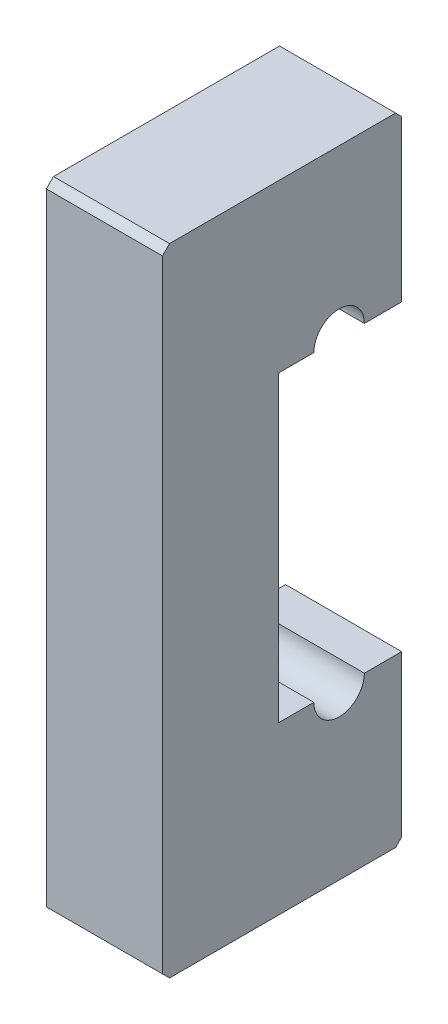
ISO-10303-21;
HEADER;
FILE_DESCRIPTION(('STEP AP214'),'2;1');
FILE_NAME('part.step','',(''),(''),'','','');
FILE_SCHEMA(('AUTOMOTIVE_DESIGN { 1 0 10303 214 1 1 1 1 }'));
ENDSEC;
DATA;
#1=APPLICATION_CONTEXT('core data for automotive mechanical design processes');
#2=APPLICATION_PROTOCOL_DEFINITION('international standard','automotive_design',2000,#1);
#3=PRODUCT_CONTEXT('',#1,'mechanical');
#4=PRODUCT('Part','Part','',(#3));
#5=PRODUCT_RELATED_PRODUCT_CATEGORY('part','',(#4));
#6=PRODUCT_DEFINITION_FORMATION('','',#4);
#7=PRODUCT_DEFINITION_CONTEXT('part definition',#1,'design');
#8=PRODUCT_DEFINITION('design','',#6,#7);
#9=PRODUCT_DEFINITION_SHAPE('','',#8);
#10=(LENGTH_UNIT() NAMED_UNIT(*) SI_UNIT(.MILLI.,.METRE.));
#11=(NAMED_UNIT(*) PLANE_ANGLE_UNIT() SI_UNIT($,.RADIAN.));
#12=(NAMED_UNIT(*) SI_UNIT($,.STERADIAN.) SOLID_ANGLE_UNIT());
#13=UNCERTAINTY_MEASURE_WITH_UNIT(LENGTH_MEASURE(1.E-05),#10,'distance_accuracy_value','');
#14=(GEOMETRIC_REPRESENTATION_CONTEXT(3) GLOBAL_UNCERTAINTY_ASSIGNED_CONTEXT((#13)) GLOBAL_UNIT_ASSIGNED_CONTEXT((#10,
#11,#12)) REPRESENTATION_CONTEXT('',''));
#15=CARTESIAN_POINT('',(0.,0.,0.));
#16=DIRECTION('',(0.,0.,1.));
#17=DIRECTION('',(1.,0.,0.));
#18=AXIS2_PLACEMENT_3D('',#15,#16,#17);
#19=CARTESIAN_POINT('',(-13.5,15.6,-5.95000000000004));
#20=DIRECTION('',(0.,-0.707106781186548,0.707106781186548));
#21=DIRECTION('',(0.,-0.707106781186548,-0.707106781186548));
#22=AXIS2_PLACEMENT_3D('',#19,#20,#21);
#23=PLANE('',#22);
#24=DIRECTION('',(1.,0.,0.));
#25=VECTOR('',#24,1.);
#26=CARTESIAN_POINT('',(-13.5,15.75,-5.80000000000004));
#27=LINE('',#26,#25);
#28=CARTESIAN_POINT('',(-19.25,15.75,-5.80000000000004));
#29=VERTEX_POINT('',#28);
#30=CARTESIAN_POINT('',(-13.5,15.75,-5.80000000000004));
#31=VERTEX_POINT('',#30);
#32=EDGE_CURVE('E270',#29,#31,#27,.T.);
#33=ORIENTED_EDGE('',*,*,#32,.T.);
#34=DIRECTION('',(0.,0.707106781186547,0.707106781186549));
#35=VECTOR('',#34,1.);
#36=CARTESIAN_POINT('',(-13.5,15.45,-6.10000000000004));
#37=LINE('',#36,#35);
#38=CARTESIAN_POINT('',(-13.5,15.45,-6.10000000000002));
#39=VERTEX_POINT('',#38);
#40=EDGE_CURVE('E128',#39,#31,#37,.T.);
#41=ORIENTED_EDGE('',*,*,#40,.F.);
#42=DIRECTION('',(1.,0.,0.));
#43=VECTOR('',#42,1.);
#44=CARTESIAN_POINT('',(-13.5,15.45,-6.10000000000003));
#45=LINE('',#44,#43);
#46=CARTESIAN_POINT('',(-19.25,15.45,-6.10000000000003));
#47=VERTEX_POINT('',#46);
#48=EDGE_CURVE('E150',#39,#47,#45,.F.);
#49=ORIENTED_EDGE('',*,*,#48,.T.);
#50=DIRECTION('',(0.,-0.707106781186548,-0.707106781186548));
#51=VECTOR('',#50,1.);
#52=CARTESIAN_POINT('',(-19.25,15.6,-5.95000000000004));
#53=LINE('',#52,#51);
#54=EDGE_CURVE('E137',#29,#47,#53,.T.);
#55=ORIENTED_EDGE('',*,*,#54,.F.);
#56=EDGE_LOOP('',(#33,#41,#49,#55));
#57=FACE_BOUND('',#56,.T.);
#58=ADVANCED_FACE('F17',(#57),#23,.F.);
#59=CARTESIAN_POINT('',(-13.5,15.75,5.39644660940673));
#60=DIRECTION('',(0.,-0.707106781186548,-0.707106781186548));
#61=DIRECTION('',(0.,0.707106781186548,-0.707106781186548));
#62=AXIS2_PLACEMENT_3D('',#59,#60,#61);
#63=PLANE('',#62);
#64=DIRECTION('',(1.,0.,0.));
#65=VECTOR('',#64,1.);
#66=CARTESIAN_POINT('',(-13.5,15.75,5.39644660940673));
#67=LINE('',#66,#65);
#68=CARTESIAN_POINT('',(-13.5,15.75,5.39644660940673));
#69=VERTEX_POINT('',#68);
#70=CARTESIAN_POINT('',(-19.25,15.75,5.39644660940672));
#71=VERTEX_POINT('',#70);
#72=EDGE_CURVE('E273',#69,#71,#67,.F.);
#73=ORIENTED_EDGE('',*,*,#72,.T.);
#74=DIRECTION('',(0.,0.707106781186548,-0.707106781186548));
#75=VECTOR('',#74,1.);
#76=CARTESIAN_POINT('',(-19.25,15.75,5.39644660940673));
#77=LINE('',#76,#75);
#78=CARTESIAN_POINT('',(-19.25,15.3964466094067,5.75000000000001));
#79=VERTEX_POINT('',#78);
#80=EDGE_CURVE('E134',#79,#71,#77,.T.);
#81=ORIENTED_EDGE('',*,*,#80,.F.);
#82=DIRECTION('',(1.,0.,0.));
#83=VECTOR('',#82,1.);
#84=CARTESIAN_POINT('',(-13.5,15.3964466094067,5.75));
#85=LINE('',#84,#83);
#86=CARTESIAN_POINT('',(-13.5,15.3964466094067,5.75000000000001));
#87=VERTEX_POINT('',#86);
#88=EDGE_CURVE('E264',#79,#87,#85,.T.);
#89=ORIENTED_EDGE('',*,*,#88,.T.);
#90=DIRECTION('',(0.,-0.707106781186578,0.707106781186517));
#91=VECTOR('',#90,1.);
#92=CARTESIAN_POINT('',(-13.5,15.75,5.39644660940673));
#93=LINE('',#92,#91);
#94=EDGE_CURVE('E125',#69,#87,#93,.T.);
#95=ORIENTED_EDGE('',*,*,#94,.F.);
#96=EDGE_LOOP('',(#73,#81,#89,#95));
#97=FACE_BOUND('',#96,.T.);
#98=ADVANCED_FACE('F322',(#97),#63,.F.);
#99=CARTESIAN_POINT('',(-13.5,-15.3964466094067,5.75));
#100=DIRECTION('',(0.,0.707106781186546,-0.707106781186549));
#101=DIRECTION('',(0.,0.707106781186549,0.707106781186546));
#102=AXIS2_PLACEMENT_3D('',#99,#100,#101);
#103=PLANE('',#102);
#104=DIRECTION('',(1.,0.,0.));
#105=VECTOR('',#104,1.);
#106=CARTESIAN_POINT('',(-13.5,-15.3964466094067,5.75));
#107=LINE('',#106,#105);
#108=CARTESIAN_POINT('',(-13.5,-15.3964466094067,5.75));
#109=VERTEX_POINT('',#108);
#110=CARTESIAN_POINT('',(-19.25,-15.3964466094067,5.75));
#111=VERTEX_POINT('',#110);
#112=EDGE_CURVE('E267',#109,#111,#107,.F.);
#113=ORIENTED_EDGE('',*,*,#112,.T.);
#114=DIRECTION('',(0.,0.707106781186549,0.707106781186546));
#115=VECTOR('',#114,1.);
#116=CARTESIAN_POINT('',(-19.25,-15.3964466094067,5.75));
#117=LINE('',#116,#115);
#118=CARTESIAN_POINT('',(-19.25,-15.75,5.39644660940672));
#119=VERTEX_POINT('',#118);
#120=EDGE_CURVE('E131',#119,#111,#117,.T.);
#121=ORIENTED_EDGE('',*,*,#120,.F.);
#122=DIRECTION('',(1.,0.,0.));
#123=VECTOR('',#122,1.);
#124=CARTESIAN_POINT('',(-13.5,-15.75,5.39644660940673));
#125=LINE('',#124,#123);
#126=CARTESIAN_POINT('',(-13.5,-15.75,5.39644660940672));
#127=VERTEX_POINT('',#126);
#128=EDGE_CURVE('E188',#119,#127,#125,.T.);
#129=ORIENTED_EDGE('',*,*,#128,.T.);
#130=DIRECTION('',(0.,-0.707106781186578,-0.707106781186517));
#131=VECTOR('',#130,1.);
#132=CARTESIAN_POINT('',(-13.5,-15.3964466094067,5.75));
#133=LINE('',#132,#131);
#134=EDGE_CURVE('E123',#109,#127,#133,.T.);
#135=ORIENTED_EDGE('',*,*,#134,.F.);
#136=EDGE_LOOP('',(#113,#121,#129,#135));
#137=FACE_BOUND('',#136,.T.);
#138=ADVANCED_FACE('F466',(#137),#103,.F.);
#139=CARTESIAN_POINT('',(-13.5,0.,-0.175000000000037));
#140=DIRECTION('',(1.,0.,0.));
#141=DIRECTION('',(0.,0.,-1.));
#142=AXIS2_PLACEMENT_3D('',#139,#140,#141);
#143=PLANE('',#142);
#144=ORIENTED_EDGE('',*,*,#134,.T.);
#145=DIRECTION('',(0.,0.,1.));
#146=VECTOR('',#145,1.);
#147=CARTESIAN_POINT('',(-13.5,-15.75,5.39644660940673));
#148=LINE('',#147,#146);
#149=CARTESIAN_POINT('',(-13.5,-15.75,-5.80000000000007));
#150=VERTEX_POINT('',#149);
#151=EDGE_CURVE('E182',#127,#150,#148,.F.);
#152=ORIENTED_EDGE('',*,*,#151,.T.);
#153=DIRECTION('',(0.,-0.707106781186553,0.707106781186542));
#154=VECTOR('',#153,1.);
#155=CARTESIAN_POINT('',(-13.5,-15.6,-5.95000000000007));
#156=LINE('',#155,#154);
#157=CARTESIAN_POINT('',(-13.5,-15.45,-6.10000000000008));
#158=VERTEX_POINT('',#157);
#159=EDGE_CURVE('E90',#150,#158,#156,.F.);
#160=ORIENTED_EDGE('',*,*,#159,.T.);
#161=DIRECTION('',(0.,-1.,0.));
#162=VECTOR('',#161,1.);
#163=CARTESIAN_POINT('',(-13.5,-15.75,-6.10000000000008));
#164=LINE('',#163,#162);
#165=CARTESIAN_POINT('',(-13.5,-7.5,-6.1));
#166=VERTEX_POINT('',#165);
#167=EDGE_CURVE('E86',#158,#166,#164,.F.);
#168=ORIENTED_EDGE('',*,*,#167,.T.);
#169=DIRECTION('',(0.,0.,-1.));
#170=VECTOR('',#169,1.);
#171=CARTESIAN_POINT('',(-13.5,-7.5,-6.1));
#172=LINE('',#171,#170);
#173=CARTESIAN_POINT('',(-13.5,-7.5,-4.25));
#174=VERTEX_POINT('',#173);
#175=EDGE_CURVE('E82',#166,#174,#172,.F.);
#176=ORIENTED_EDGE('',*,*,#175,.T.);
#177=CARTESIAN_POINT('',(-13.5,-7.5,-3.));
#178=DIRECTION('',(1.,0.,0.));
#179=DIRECTION('',(0.,0.,-1.));
#180=AXIS2_PLACEMENT_3D('',#177,#178,#179);
#181=CIRCLE('',#180,1.25);
#182=CARTESIAN_POINT('',(-13.5,-7.5,-1.75));
#183=VERTEX_POINT('',#182);
#184=EDGE_CURVE('E20',#174,#183,#181,.F.);
#185=ORIENTED_EDGE('',*,*,#184,.T.);
#186=DIRECTION('',(0.,0.,-1.));
#187=VECTOR('',#186,1.);
#188=CARTESIAN_POINT('',(-13.5,-7.5,-1.75));
#189=LINE('',#188,#187);
#190=CARTESIAN_POINT('',(-13.5,-7.5,0.));
#191=VERTEX_POINT('',#190);
#192=EDGE_CURVE('E165',#183,#191,#189,.F.);
#193=ORIENTED_EDGE('',*,*,#192,.T.);
#194=DIRECTION('',(0.,-1.,0.));
#195=VECTOR('',#194,1.);
#196=CARTESIAN_POINT('',(-13.5,-7.5,0.));
#197=LINE('',#196,#195);
#198=CARTESIAN_POINT('',(-13.5,7.5,0.));
#199=VERTEX_POINT('',#198);
#200=EDGE_CURVE('E159',#191,#199,#197,.F.);
#201=ORIENTED_EDGE('',*,*,#200,.T.);
#202=DIRECTION('',(0.,0.,1.));
#203=VECTOR('',#202,1.);
#204=CARTESIAN_POINT('',(-13.5,7.5,0.));
#205=LINE('',#204,#203);
#206=CARTESIAN_POINT('',(-13.5,7.5,-1.75));
#207=VERTEX_POINT('',#206);
#208=EDGE_CURVE('E153',#199,#207,#205,.F.);
#209=ORIENTED_EDGE('',*,*,#208,.T.);
#210=CARTESIAN_POINT('',(-13.5,7.5,-3.));
#211=DIRECTION('',(1.,0.,0.));
#212=DIRECTION('',(0.,0.,-1.));
#213=AXIS2_PLACEMENT_3D('',#210,#211,#212);
#214=CIRCLE('',#213,1.25);
#215=CARTESIAN_POINT('',(-13.5,7.5,-4.25));
#216=VERTEX_POINT('',#215);
#217=EDGE_CURVE('E199',#207,#216,#214,.F.);
#218=ORIENTED_EDGE('',*,*,#217,.T.);
#219=DIRECTION('',(0.,0.,1.));
#220=VECTOR('',#219,1.);
#221=CARTESIAN_POINT('',(-13.5,7.5,-4.25));
#222=LINE('',#221,#220);
#223=CARTESIAN_POINT('',(-13.5,7.5,-6.1));
#224=VERTEX_POINT('',#223);
#225=EDGE_CURVE('E140',#216,#224,#222,.F.);
#226=ORIENTED_EDGE('',*,*,#225,.T.);
#227=DIRECTION('',(0.,-1.,0.));
#228=VECTOR('',#227,1.);
#229=CARTESIAN_POINT('',(-13.5,7.5,-6.1));
#230=LINE('',#229,#228);
#231=EDGE_CURVE('E147',#224,#39,#230,.F.);
#232=ORIENTED_EDGE('',*,*,#231,.T.);
#233=ORIENTED_EDGE('',*,*,#40,.T.);
#234=DIRECTION('',(0.,0.,-1.));
#235=VECTOR('',#234,1.);
#236=CARTESIAN_POINT('',(-13.5,15.75,-6.10000000000004));
#237=LINE('',#236,#235);
#238=EDGE_CURVE('E276',#31,#69,#237,.F.);
#239=ORIENTED_EDGE('',*,*,#238,.T.);
#240=ORIENTED_EDGE('',*,*,#94,.T.);
#241=DIRECTION('',(0.,1.,0.));
#242=VECTOR('',#241,1.);
#243=CARTESIAN_POINT('',(-13.5,15.3964466094067,5.75));
#244=LINE('',#243,#242);
#245=EDGE_CURVE('E261',#87,#109,#244,.F.);
#246=ORIENTED_EDGE('',*,*,#245,.T.);
#247=EDGE_LOOP('',(#144,#152,#160,#168,#176,#185,#193,#201,#209,#218,#226,#232,#233,#239,#240,#246));
#248=FACE_BOUND('',#247,.T.);
#249=ADVANCED_FACE('F88',(#248),#143,.T.);
#250=CARTESIAN_POINT('',(-13.5,-15.6,-5.95000000000007));
#251=DIRECTION('',(0.,0.707106781186542,0.707106781186553));
#252=DIRECTION('',(0.,-0.707106781186553,0.707106781186542));
#253=AXIS2_PLACEMENT_3D('',#250,#251,#252);
#254=PLANE('',#253);
#255=DIRECTION('',(1.,0.,0.));
#256=VECTOR('',#255,1.);
#257=CARTESIAN_POINT('',(-13.5,-15.45,-6.10000000000008));
#258=LINE('',#257,#256);
#259=CARTESIAN_POINT('',(-19.25,-15.45,-6.10000000000007));
#260=VERTEX_POINT('',#259);
#261=EDGE_CURVE('E95',#260,#158,#258,.T.);
#262=ORIENTED_EDGE('',*,*,#261,.T.);
#263=ORIENTED_EDGE('',*,*,#159,.F.);
#264=DIRECTION('',(1.,0.,0.));
#265=VECTOR('',#264,1.);
#266=CARTESIAN_POINT('',(-13.5,-15.75,-5.80000000000007));
#267=LINE('',#266,#265);
#268=CARTESIAN_POINT('',(-19.25,-15.75,-5.80000000000007));
#269=VERTEX_POINT('',#268);
#270=EDGE_CURVE('E118',#150,#269,#267,.F.);
#271=ORIENTED_EDGE('',*,*,#270,.T.);
#272=DIRECTION('',(0.,-0.707106781186553,0.707106781186542));
#273=VECTOR('',#272,1.);
#274=CARTESIAN_POINT('',(-19.25,-15.6,-5.95000000000007));
#275=LINE('',#274,#273);
#276=EDGE_CURVE('E35',#260,#269,#275,.T.);
#277=ORIENTED_EDGE('',*,*,#276,.F.);
#278=EDGE_LOOP('',(#262,#263,#271,#277));
#279=FACE_BOUND('',#278,.T.);
#280=ADVANCED_FACE('F450',(#279),#254,.F.);
#281=CARTESIAN_POINT('',(-13.5,-15.75,-6.10000000000008));
#282=DIRECTION('',(0.,0.,1.));
#283=DIRECTION('',(0.,-1.,0.));
#284=AXIS2_PLACEMENT_3D('',#281,#282,#283);
#285=PLANE('',#284);
#286=DIRECTION('',(0.,1.,0.));
#287=VECTOR('',#286,1.);
#288=CARTESIAN_POINT('',(-19.25,0.,-6.10000000000007));
#289=LINE('',#288,#287);
#290=CARTESIAN_POINT('',(-19.25,-7.5,-6.10000000000005));
#291=VERTEX_POINT('',#290);
#292=EDGE_CURVE('E108',#260,#291,#289,.T.);
#293=ORIENTED_EDGE('',*,*,#292,.T.);
#294=DIRECTION('',(1.,0.,0.));
#295=VECTOR('',#294,1.);
#296=CARTESIAN_POINT('',(-13.5,-7.5,-6.1));
#297=LINE('',#296,#295);
#298=EDGE_CURVE('E102',#291,#166,#297,.T.);
#299=ORIENTED_EDGE('',*,*,#298,.T.);
#300=ORIENTED_EDGE('',*,*,#167,.F.);
#301=ORIENTED_EDGE('',*,*,#261,.F.);
#302=EDGE_LOOP('',(#293,#299,#300,#301));
#303=FACE_BOUND('',#302,.T.);
#304=ADVANCED_FACE('F107',(#303),#285,.F.);
#305=CARTESIAN_POINT('',(-13.5,-7.5,-6.1));
#306=DIRECTION('',(0.,-1.,0.));
#307=DIRECTION('',(0.,0.,-1.));
#308=AXIS2_PLACEMENT_3D('',#305,#306,#307);
#309=PLANE('',#308);
#310=ORIENTED_EDGE('',*,*,#298,.F.);
#311=DIRECTION('',(0.,0.,-1.));
#312=VECTOR('',#311,1.);
#313=CARTESIAN_POINT('',(-19.25,-7.5,-0.175000000000037));
#314=LINE('',#313,#312);
#315=CARTESIAN_POINT('',(-19.25,-7.5,-4.25));
#316=VERTEX_POINT('',#315);
#317=EDGE_CURVE('E117',#291,#316,#314,.F.);
#318=ORIENTED_EDGE('',*,*,#317,.T.);
#319=DIRECTION('',(1.,0.,0.));
#320=VECTOR('',#319,1.);
#321=CARTESIAN_POINT('',(-13.5,-7.5,-4.25));
#322=LINE('',#321,#320);
#323=EDGE_CURVE('E104',#316,#174,#322,.T.);
#324=ORIENTED_EDGE('',*,*,#323,.T.);
#325=ORIENTED_EDGE('',*,*,#175,.F.);
#326=EDGE_LOOP('',(#310,#318,#324,#325));
#327=FACE_BOUND('',#326,.T.);
#328=ADVANCED_FACE('F100',(#327),#309,.F.);
#329=CARTESIAN_POINT('',(-13.5,-7.5,-3.));
#330=DIRECTION('',(1.,0.,0.));
#331=DIRECTION('',(0.,0.,-1.));
#332=AXIS2_PLACEMENT_3D('',#329,#330,#331);
#333=CYLINDRICAL_SURFACE('',#332,1.25);
#334=ORIENTED_EDGE('',*,*,#323,.F.);
#335=CARTESIAN_POINT('',(-19.25,-7.5,-3.));
#336=DIRECTION('',(1.,0.,0.));
#337=DIRECTION('',(0.,0.,-1.));
#338=AXIS2_PLACEMENT_3D('',#335,#336,#337);
#339=CIRCLE('',#338,1.25);
#340=CARTESIAN_POINT('',(-19.25,-7.5,-1.75));
#341=VERTEX_POINT('',#340);
#342=EDGE_CURVE('E196',#316,#341,#339,.F.);
#343=ORIENTED_EDGE('',*,*,#342,.T.);
#344=DIRECTION('',(1.,0.,0.));
#345=VECTOR('',#344,1.);
#346=CARTESIAN_POINT('',(-13.5,-7.5,-1.75));
#347=LINE('',#346,#345);
#348=EDGE_CURVE('E168',#341,#183,#347,.T.);
#349=ORIENTED_EDGE('',*,*,#348,.T.);
#350=ORIENTED_EDGE('',*,*,#184,.F.);
#351=EDGE_LOOP('',(#334,#343,#349,#350));
#352=FACE_BOUND('',#351,.T.);
#353=ADVANCED_FACE('F428',(#352),#333,.F.);
#354=CARTESIAN_POINT('',(-13.5,-7.5,-1.75));
#355=DIRECTION('',(0.,-1.,0.));
#356=DIRECTION('',(0.,0.,-1.));
#357=AXIS2_PLACEMENT_3D('',#354,#355,#356);
#358=PLANE('',#357);
#359=ORIENTED_EDGE('',*,*,#348,.F.);
#360=DIRECTION('',(0.,0.,-1.));
#361=VECTOR('',#360,1.);
#362=CARTESIAN_POINT('',(-19.25,-7.5,-0.175000000000037));
#363=LINE('',#362,#361);
#364=CARTESIAN_POINT('',(-19.25,-7.5,0.));
#365=VERTEX_POINT('',#364);
#366=EDGE_CURVE('E198',#341,#365,#363,.F.);
#367=ORIENTED_EDGE('',*,*,#366,.T.);
#368=DIRECTION('',(1.,0.,0.));
#369=VECTOR('',#368,1.);
#370=CARTESIAN_POINT('',(-13.5,-7.5,0.));
#371=LINE('',#370,#369);
#372=EDGE_CURVE('E162',#365,#191,#371,.T.);
#373=ORIENTED_EDGE('',*,*,#372,.T.);
#374=ORIENTED_EDGE('',*,*,#192,.F.);
#375=EDGE_LOOP('',(#359,#367,#373,#374));
#376=FACE_BOUND('',#375,.T.);
#377=ADVANCED_FACE('F230',(#376),#358,.F.);
#378=CARTESIAN_POINT('',(-13.5,-7.5,0.));
#379=DIRECTION('',(0.,0.,1.));
#380=DIRECTION('',(0.,-1.,0.));
#381=AXIS2_PLACEMENT_3D('',#378,#379,#380);
#382=PLANE('',#381);
#383=ORIENTED_EDGE('',*,*,#372,.F.);
#384=DIRECTION('',(0.,1.,0.));
#385=VECTOR('',#384,1.);
#386=CARTESIAN_POINT('',(-19.25,0.,0.));
#387=LINE('',#386,#385);
#388=CARTESIAN_POINT('',(-19.25,7.5,0.));
#389=VERTEX_POINT('',#388);
#390=EDGE_CURVE('E217',#365,#389,#387,.T.);
#391=ORIENTED_EDGE('',*,*,#390,.T.);
#392=DIRECTION('',(1.,0.,0.));
#393=VECTOR('',#392,1.);
#394=CARTESIAN_POINT('',(-13.5,7.5,0.));
#395=LINE('',#394,#393);
#396=EDGE_CURVE('E156',#389,#199,#395,.T.);
#397=ORIENTED_EDGE('',*,*,#396,.T.);
#398=ORIENTED_EDGE('',*,*,#200,.F.);
#399=EDGE_LOOP('',(#383,#391,#397,#398));
#400=FACE_BOUND('',#399,.T.);
#401=ADVANCED_FACE('F237',(#400),#382,.F.);
#402=CARTESIAN_POINT('',(-13.5,7.5,0.));
#403=DIRECTION('',(0.,1.,0.));
#404=DIRECTION('',(0.,0.,1.));
#405=AXIS2_PLACEMENT_3D('',#402,#403,#404);
#406=PLANE('',#405);
#407=ORIENTED_EDGE('',*,*,#396,.F.);
#408=DIRECTION('',(0.,0.,-1.));
#409=VECTOR('',#408,1.);
#410=CARTESIAN_POINT('',(-19.25,7.5,-0.175000000000037));
#411=LINE('',#410,#409);
#412=CARTESIAN_POINT('',(-19.25,7.5,-1.75));
#413=VERTEX_POINT('',#412);
#414=EDGE_CURVE('E195',#389,#413,#411,.T.);
#415=ORIENTED_EDGE('',*,*,#414,.T.);
#416=DIRECTION('',(1.,0.,0.));
#417=VECTOR('',#416,1.);
#418=CARTESIAN_POINT('',(-13.5,7.5,-1.75));
#419=LINE('',#418,#417);
#420=EDGE_CURVE('E155',#413,#207,#419,.T.);
#421=ORIENTED_EDGE('',*,*,#420,.T.);
#422=ORIENTED_EDGE('',*,*,#208,.F.);
#423=EDGE_LOOP('',(#407,#415,#421,#422));
#424=FACE_BOUND('',#423,.T.);
#425=ADVANCED_FACE('F336',(#424),#406,.F.);
#426=CARTESIAN_POINT('',(-13.5,7.5,-3.));
#427=DIRECTION('',(1.,0.,0.));
#428=DIRECTION('',(0.,0.,-1.));
#429=AXIS2_PLACEMENT_3D('',#426,#427,#428);
#430=CYLINDRICAL_SURFACE('',#429,1.25);
#431=ORIENTED_EDGE('',*,*,#420,.F.);
#432=CARTESIAN_POINT('',(-19.25,7.5,-3.));
#433=DIRECTION('',(1.,0.,0.));
#434=DIRECTION('',(0.,0.,-1.));
#435=AXIS2_PLACEMENT_3D('',#432,#433,#434);
#436=CIRCLE('',#435,1.25);
#437=CARTESIAN_POINT('',(-19.25,7.5,-4.25));
#438=VERTEX_POINT('',#437);
#439=EDGE_CURVE('E191',#413,#438,#436,.F.);
#440=ORIENTED_EDGE('',*,*,#439,.T.);
#441=DIRECTION('',(1.,0.,0.));
#442=VECTOR('',#441,1.);
#443=CARTESIAN_POINT('',(-13.5,7.5,-4.25));
#444=LINE('',#443,#442);
#445=EDGE_CURVE('E144',#438,#216,#444,.T.);
#446=ORIENTED_EDGE('',*,*,#445,.T.);
#447=ORIENTED_EDGE('',*,*,#217,.F.);
#448=EDGE_LOOP('',(#431,#440,#446,#447));
#449=FACE_BOUND('',#448,.T.);
#450=ADVANCED_FACE('F338',(#449),#430,.F.);
#451=CARTESIAN_POINT('',(-13.5,7.5,-4.25));
#452=DIRECTION('',(0.,1.,0.));
#453=DIRECTION('',(0.,0.,1.));
#454=AXIS2_PLACEMENT_3D('',#451,#452,#453);
#455=PLANE('',#454);
#456=ORIENTED_EDGE('',*,*,#445,.F.);
#457=DIRECTION('',(0.,0.,-1.));
#458=VECTOR('',#457,1.);
#459=CARTESIAN_POINT('',(-19.25,7.5,-0.175000000000037));
#460=LINE('',#459,#458);
#461=CARTESIAN_POINT('',(-19.25,7.5,-6.1));
#462=VERTEX_POINT('',#461);
#463=EDGE_CURVE('E194',#438,#462,#460,.T.);
#464=ORIENTED_EDGE('',*,*,#463,.T.);
#465=DIRECTION('',(1.,0.,0.));
#466=VECTOR('',#465,1.);
#467=CARTESIAN_POINT('',(-13.5,7.5,-6.1));
#468=LINE('',#467,#466);
#469=EDGE_CURVE('E143',#462,#224,#468,.T.);
#470=ORIENTED_EDGE('',*,*,#469,.T.);
#471=ORIENTED_EDGE('',*,*,#225,.F.);
#472=EDGE_LOOP('',(#456,#464,#470,#471));
#473=FACE_BOUND('',#472,.T.);
#474=ADVANCED_FACE('F290',(#473),#455,.F.);
#475=CARTESIAN_POINT('',(-13.5,7.5,-6.1));
#476=DIRECTION('',(0.,0.,1.));
#477=DIRECTION('',(0.,-1.,0.));
#478=AXIS2_PLACEMENT_3D('',#475,#476,#477);
#479=PLANE('',#478);
#480=ORIENTED_EDGE('',*,*,#231,.F.);
#481=ORIENTED_EDGE('',*,*,#469,.F.);
#482=DIRECTION('',(0.,1.,0.));
#483=VECTOR('',#482,1.);
#484=CARTESIAN_POINT('',(-19.25,0.,-6.1));
#485=LINE('',#484,#483);
#486=EDGE_CURVE('E281',#462,#47,#485,.T.);
#487=ORIENTED_EDGE('',*,*,#486,.T.);
#488=ORIENTED_EDGE('',*,*,#48,.F.);
#489=EDGE_LOOP('',(#480,#481,#487,#488));
#490=FACE_BOUND('',#489,.T.);
#491=ADVANCED_FACE('F296',(#490),#479,.F.);
#492=CARTESIAN_POINT('',(-13.5,15.75,-6.10000000000004));
#493=DIRECTION('',(0.,-1.,0.));
#494=DIRECTION('',(0.,0.,-1.));
#495=AXIS2_PLACEMENT_3D('',#492,#493,#494);
#496=PLANE('',#495);
#497=DIRECTION('',(0.,0.,-1.));
#498=VECTOR('',#497,1.);
#499=CARTESIAN_POINT('',(-19.25,15.75,-0.175000000000037));
#500=LINE('',#499,#498);
#501=EDGE_CURVE('E284',#29,#71,#500,.F.);
#502=ORIENTED_EDGE('',*,*,#501,.T.);
#503=ORIENTED_EDGE('',*,*,#72,.F.);
#504=ORIENTED_EDGE('',*,*,#238,.F.);
#505=ORIENTED_EDGE('',*,*,#32,.F.);
#506=EDGE_LOOP('',(#502,#503,#504,#505));
#507=FACE_BOUND('',#506,.T.);
#508=ADVANCED_FACE('F315',(#507),#496,.F.);
#509=CARTESIAN_POINT('',(-13.5,15.3964466094067,5.75));
#510=DIRECTION('',(0.,0.,-1.));
#511=DIRECTION('',(0.,1.,0.));
#512=AXIS2_PLACEMENT_3D('',#509,#510,#511);
#513=PLANE('',#512);
#514=ORIENTED_EDGE('',*,*,#88,.F.);
#515=DIRECTION('',(0.,1.,0.));
#516=VECTOR('',#515,1.);
#517=CARTESIAN_POINT('',(-19.25,0.,5.75));
#518=LINE('',#517,#516);
#519=EDGE_CURVE('E26',#79,#111,#518,.F.);
#520=ORIENTED_EDGE('',*,*,#519,.T.);
#521=ORIENTED_EDGE('',*,*,#112,.F.);
#522=ORIENTED_EDGE('',*,*,#245,.F.);
#523=EDGE_LOOP('',(#514,#520,#521,#522));
#524=FACE_BOUND('',#523,.T.);
#525=ADVANCED_FACE('F354',(#524),#513,.F.);
#526=CARTESIAN_POINT('',(-13.5,-15.75,5.39644660940673));
#527=DIRECTION('',(0.,1.,0.));
#528=DIRECTION('',(0.,0.,1.));
#529=AXIS2_PLACEMENT_3D('',#526,#527,#528);
#530=PLANE('',#529);
#531=ORIENTED_EDGE('',*,*,#151,.F.);
#532=ORIENTED_EDGE('',*,*,#128,.F.);
#533=DIRECTION('',(0.,0.,-1.));
#534=VECTOR('',#533,1.);
#535=CARTESIAN_POINT('',(-19.25,-15.75,-0.175000000000037));
#536=LINE('',#535,#534);
#537=EDGE_CURVE('E11',#119,#269,#536,.T.);
#538=ORIENTED_EDGE('',*,*,#537,.T.);
#539=ORIENTED_EDGE('',*,*,#270,.F.);
#540=EDGE_LOOP('',(#531,#532,#538,#539));
#541=FACE_BOUND('',#540,.T.);
#542=ADVANCED_FACE('F349',(#541),#530,.F.);
#543=CARTESIAN_POINT('',(-19.25,0.,-0.175000000000037));
#544=DIRECTION('',(1.,0.,0.));
#545=DIRECTION('',(0.,0.,-1.));
#546=AXIS2_PLACEMENT_3D('',#543,#544,#545);
#547=PLANE('',#546);
#548=ORIENTED_EDGE('',*,*,#537,.F.);
#549=ORIENTED_EDGE('',*,*,#120,.T.);
#550=ORIENTED_EDGE('',*,*,#519,.F.);
#551=ORIENTED_EDGE('',*,*,#80,.T.);
#552=ORIENTED_EDGE('',*,*,#501,.F.);
#553=ORIENTED_EDGE('',*,*,#54,.T.);
#554=ORIENTED_EDGE('',*,*,#486,.F.);
#555=ORIENTED_EDGE('',*,*,#463,.F.);
#556=ORIENTED_EDGE('',*,*,#439,.F.);
#557=ORIENTED_EDGE('',*,*,#414,.F.);
#558=ORIENTED_EDGE('',*,*,#390,.F.);
#559=ORIENTED_EDGE('',*,*,#366,.F.);
#560=ORIENTED_EDGE('',*,*,#342,.F.);
#561=ORIENTED_EDGE('',*,*,#317,.F.);
#562=ORIENTED_EDGE('',*,*,#292,.F.);
#563=ORIENTED_EDGE('',*,*,#276,.T.);
#564=EDGE_LOOP('',(#548,#549,#550,#551,#552,#553,#554,#555,#556,#557,#558,#559,#560,#561,#562,#563));
#565=FACE_BOUND('',#564,.T.);
#566=ADVANCED_FACE('F240',(#565),#547,.F.);
#567=CLOSED_SHELL('',(#58,#98,#138,#249,#280,#304,#328,#353,#377,#401,#425,#450,#474,#491,#508,
#525,#542,#566));
#568=MANIFOLD_SOLID_BREP('B1',#567);
#569=ADVANCED_BREP_SHAPE_REPRESENTATION('',(#18,#568),#14);
#570=SHAPE_DEFINITION_REPRESENTATION(#9,#569);
ENDSEC;
END-ISO-10303-21;
